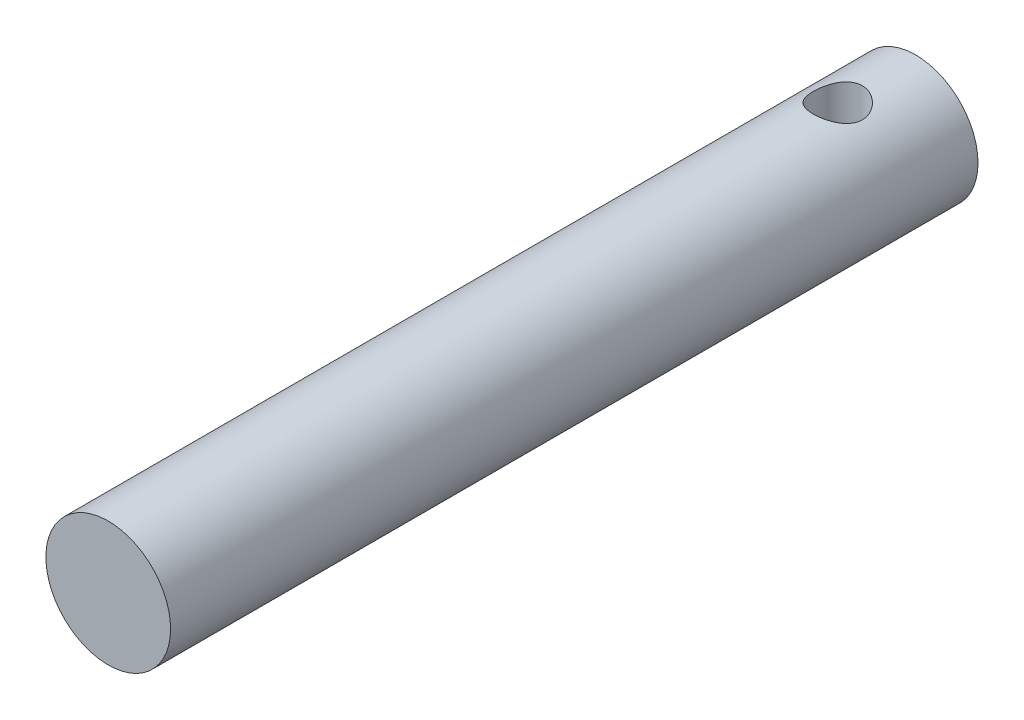
ISO-10303-21;
HEADER;
FILE_DESCRIPTION(('STEP AP214'),'2;1');
FILE_NAME('part.step','',(''),(''),'','','');
FILE_SCHEMA(('AUTOMOTIVE_DESIGN { 1 0 10303 214 1 1 1 1 }'));
ENDSEC;
DATA;
#1=APPLICATION_CONTEXT('core data for automotive mechanical design processes');
#2=APPLICATION_PROTOCOL_DEFINITION('international standard','automotive_design',2000,#1);
#3=PRODUCT_CONTEXT('',#1,'mechanical');
#4=PRODUCT('Part','Part','',(#3));
#5=PRODUCT_RELATED_PRODUCT_CATEGORY('part','',(#4));
#6=PRODUCT_DEFINITION_FORMATION('','',#4);
#7=PRODUCT_DEFINITION_CONTEXT('part definition',#1,'design');
#8=PRODUCT_DEFINITION('design','',#6,#7);
#9=PRODUCT_DEFINITION_SHAPE('','',#8);
#10=(LENGTH_UNIT() NAMED_UNIT(*) SI_UNIT(.MILLI.,.METRE.));
#11=(NAMED_UNIT(*) PLANE_ANGLE_UNIT() SI_UNIT($,.RADIAN.));
#12=(NAMED_UNIT(*) SI_UNIT($,.STERADIAN.) SOLID_ANGLE_UNIT());
#13=UNCERTAINTY_MEASURE_WITH_UNIT(LENGTH_MEASURE(1.E-05),#10,'distance_accuracy_value','');
#14=(GEOMETRIC_REPRESENTATION_CONTEXT(3) GLOBAL_UNCERTAINTY_ASSIGNED_CONTEXT((#13)) GLOBAL_UNIT_ASSIGNED_CONTEXT((#10,
#11,#12)) REPRESENTATION_CONTEXT('',''));
#15=CARTESIAN_POINT('',(0.,0.,0.));
#16=DIRECTION('',(0.,0.,1.));
#17=DIRECTION('',(1.,0.,0.));
#18=AXIS2_PLACEMENT_3D('',#15,#16,#17);
#19=CARTESIAN_POINT('',(0.,0.,51.8));
#20=DIRECTION('',(0.,0.,-1.));
#21=DIRECTION('',(-1.,0.,0.));
#22=AXIS2_PLACEMENT_3D('',#19,#20,#21);
#23=CYLINDRICAL_SURFACE('',#22,4.);
#24=CARTESIAN_POINT('',(0.,-4.,6.575));
#25=CARTESIAN_POINT('',(-0.084777957351503,-3.99999371475786,6.5749913504673));
#26=CARTESIAN_POINT('',(-0.169682998159235,-3.99727371103869,6.56811600545231));
#27=CARTESIAN_POINT('',(-0.337099997729513,-3.98665835198979,6.54085024426793));
#28=CARTESIAN_POINT('',(-0.419605283421263,-3.97874978320654,6.52042532059411));
#29=CARTESIAN_POINT('',(-0.579541037228178,-3.95861166157483,6.46691575860037));
#30=CARTESIAN_POINT('',(-0.656986633552023,-3.94639576106684,6.43387109211161));
#31=CARTESIAN_POINT('',(-0.805171409141907,-3.91885018887286,6.3562174109327));
#32=CARTESIAN_POINT('',(-0.875912626211128,-3.90352146781271,6.31161192566052));
#33=CARTESIAN_POINT('',(-1.01202123881492,-3.87051957423171,6.2099387442384));
#34=CARTESIAN_POINT('',(-1.07704023299287,-3.85277517023923,6.15242792977124));
#35=CARTESIAN_POINT('',(-1.19680261742581,-3.81727298467867,6.02751213720201));
#36=CARTESIAN_POINT('',(-1.25154127100046,-3.79951520071053,5.96010262362511));
#37=CARTESIAN_POINT('',(-1.35149622712963,-3.76515274878395,5.81379400336829));
#38=CARTESIAN_POINT('',(-1.39620428835686,-3.74863004117912,5.73452645967399));
#39=CARTESIAN_POINT('',(-1.4714979631349,-3.71972210574232,5.56884754848047));
#40=CARTESIAN_POINT('',(-1.50209002876568,-3.70733498834933,5.48243946608596));
#41=CARTESIAN_POINT('',(-1.54688452039642,-3.68886368487684,5.30893328431349));
#42=CARTESIAN_POINT('',(-1.56175270070066,-3.68252469132068,5.22203516293125));
#43=CARTESIAN_POINT('',(-1.57675761493808,-3.67612688298866,5.04676403011906));
#44=CARTESIAN_POINT('',(-1.57690129576139,-3.67606510667669,4.95839173387513));
#45=CARTESIAN_POINT('',(-1.56295884668395,-3.68201073018886,4.78899793457456));
#46=CARTESIAN_POINT('',(-1.54982637788304,-3.68761138493157,4.70788091917912));
#47=CARTESIAN_POINT('',(-1.51129105930388,-3.70356985031701,4.54911165377539));
#48=CARTESIAN_POINT('',(-1.48588614051495,-3.71392846308876,4.47145999040257));
#49=CARTESIAN_POINT('',(-1.42304900510824,-3.73846017950747,4.31998753086632));
#50=CARTESIAN_POINT('',(-1.38538580029301,-3.75270561609433,4.24627479364249));
#51=CARTESIAN_POINT('',(-1.29926305698382,-3.78338491615335,4.10595079309995));
#52=CARTESIAN_POINT('',(-1.25079954413666,-3.79981958433241,4.03934215736088));
#53=CARTESIAN_POINT('',(-1.14019477904158,-3.83452142143146,3.90988154903872));
#54=CARTESIAN_POINT('',(-1.07730223583062,-3.85283377175234,3.84768186986216));
#55=CARTESIAN_POINT('',(-0.941779585031376,-3.88818092911688,3.73450742601084));
#56=CARTESIAN_POINT('',(-0.86914766023362,-3.90521549682,3.68353476081501));
#57=CARTESIAN_POINT('',(-0.714405632415331,-3.9364909974616,3.59344090793809));
#58=CARTESIAN_POINT('',(-0.632144307591836,-3.95067404747593,3.55455790470879));
#59=CARTESIAN_POINT('',(-0.461548638212615,-3.97421306585263,3.49140490019745));
#60=CARTESIAN_POINT('',(-0.373217303441472,-3.98357140722824,3.46712771412097));
#61=CARTESIAN_POINT('',(-0.198462358887899,-3.99597801788296,3.43517798744733));
#62=CARTESIAN_POINT('',(-0.112222626172096,-3.99935914098446,3.42662839759178));
#63=CARTESIAN_POINT('',(0.0605167823400057,-4.00047376408071,3.4237959948164));
#64=CARTESIAN_POINT('',(0.147016387944331,-3.99820867234557,3.42950962438713));
#65=CARTESIAN_POINT('',(0.313892303734837,-3.98850378373963,3.45439079842812));
#66=CARTESIAN_POINT('',(0.39437165124116,-3.98129199937254,3.47296585256132));
#67=CARTESIAN_POINT('',(0.551001661904486,-3.96265344988104,3.52224308988292));
#68=CARTESIAN_POINT('',(0.627151765123054,-3.95122614095146,3.55294683771621));
#69=CARTESIAN_POINT('',(0.775558341492031,-3.92483948181058,3.62660805564172));
#70=CARTESIAN_POINT('',(0.847626598447584,-3.90978349311696,3.66990902342593));
#71=CARTESIAN_POINT('',(0.983724744227115,-3.87778045628887,3.76715276739036));
#72=CARTESIAN_POINT('',(1.0477514529063,-3.86083266498705,3.82109973213253));
#73=CARTESIAN_POINT('',(1.17024451292195,-3.82555203890851,3.94215661270057));
#74=CARTESIAN_POINT('',(1.22809278030705,-3.80719997766011,4.00988797592606));
#75=CARTESIAN_POINT('',(1.33174647713903,-3.77219465383469,4.15443150282617));
#76=CARTESIAN_POINT('',(1.37755017513242,-3.75554163571206,4.23124496979012));
#77=CARTESIAN_POINT('',(1.45603682361559,-3.72582087293399,4.39278803576521));
#78=CARTESIAN_POINT('',(1.48860964322187,-3.71278349733253,4.47757712329371));
#79=CARTESIAN_POINT('',(1.53877245108985,-3.69227947569873,4.65210243409606));
#80=CARTESIAN_POINT('',(1.55637302525858,-3.68480889421037,4.74183511419922));
#81=CARTESIAN_POINT('',(1.57509591497035,-3.67684195065122,4.91692803991798));
#82=CARTESIAN_POINT('',(1.5772860734323,-3.6758937420289,5.00215431051799));
#83=CARTESIAN_POINT('',(1.56791275226873,-3.67990154786674,5.17169719904443));
#84=CARTESIAN_POINT('',(1.55635089322198,-3.68485686663772,5.25601392297312));
#85=CARTESIAN_POINT('',(1.52066391144084,-3.6997203856089,5.41814425204745));
#86=CARTESIAN_POINT('',(1.49702111331917,-3.70943788900835,5.49608307424026));
#87=CARTESIAN_POINT('',(1.43828779116844,-3.73260226373705,5.64692245392718));
#88=CARTESIAN_POINT('',(1.40319424484293,-3.74605011951035,5.71982167511244));
#89=CARTESIAN_POINT('',(1.32027940505378,-3.77609694201628,5.86296438731432));
#90=CARTESIAN_POINT('',(1.27185474580919,-3.79283032284862,5.93282972651265));
#91=CARTESIAN_POINT('',(1.16454412559117,-3.82714084093243,6.06378253986384));
#92=CARTESIAN_POINT('',(1.10565450981896,-3.84471827139098,6.12486693381897));
#93=CARTESIAN_POINT('',(0.974730917482345,-3.8800479008807,6.24040765302804));
#94=CARTESIAN_POINT('',(0.902107589375748,-3.89774310203432,6.29421634714681));
#95=CARTESIAN_POINT('',(0.748205773672022,-3.9301854745353,6.38887250744573));
#96=CARTESIAN_POINT('',(0.666926137124022,-3.94493225378965,6.42971825018406));
#97=CARTESIAN_POINT('',(0.505143265297428,-3.96874604080368,6.49411684047061));
#98=CARTESIAN_POINT('',(0.425161570693122,-3.9781893540543,6.51884470323385));
#99=CARTESIAN_POINT('',(0.262019529546968,-3.99224240110566,6.55528644356018));
#100=CARTESIAN_POINT('',(0.178868575204488,-3.99686541666115,6.56703608639648));
#101=CARTESIAN_POINT('',(0.0636199690864305,-3.99962244799311,6.57403921053329));
#102=CARTESIAN_POINT('',(0.03181893539601,-4.00000235898245,6.57500324635));
#103=CARTESIAN_POINT('',(0.,-4.,6.575));
#104=B_SPLINE_CURVE_WITH_KNOTS('',3,(#24,#25,#26,#27,#28,#29,#30,#31,#32,#33,#34,#35,#36,#37,
#38,#39,#40,#41,#42,#43,#44,#45,#46,#47,#48,#49,#50,#51,#52,#53,#54,#55,#56,#57,#58,#59,#60,#61,
#62,#63,#64,#65,#66,#67,#68,#69,#70,#71,#72,#73,#74,#75,#76,#77,#78,#79,#80,#81,#82,#83,#84,#85,
#86,#87,#88,#89,#90,#91,#92,#93,#94,#95,#96,#97,#98,#99,#100,#101,#102,#103),.UNSPECIFIED.,.T.,
.F.,(4,2,2,2,2,2,2,2,2,2,2,2,2,2,2,2,2,2,2,2,2,2,2,2,2,2,2,2,2,2,2,2,2,2,2,2,2,2,2,4),(0.,
0.254239588162719,0.509129161714249,0.763218004382729,1.01722936711086,1.28186231395848,
1.54661689324381,1.82271064959156,2.09867808485329,2.36242561173228,2.62604870426095,
2.87199219089392,3.11797715558421,3.36889531912676,3.61990596974727,3.88966690514255,
4.15947824373952,4.43431028043799,4.70900701285129,4.96785798249349,5.2266443963902,
5.47423976701851,5.72186708877203,5.97700701922233,6.23224753280258,6.50382283959259,
6.77543716506832,7.04926817126425,7.32290540795412,7.57737617303126,7.83181695348511,
8.07681203446012,8.32187183151417,8.58067351569428,8.83956576247479,9.11454362371647,
9.38955802833389,9.64119010629957,9.89212699500845,9.98754841448564),.UNSPECIFIED.);
#105=CARTESIAN_POINT('',(0.,-4.,6.575));
#106=VERTEX_POINT('',#105);
#107=EDGE_CURVE('E41',#106,#106,#104,.T.);
#108=ORIENTED_EDGE('',*,*,#107,.F.);
#109=EDGE_LOOP('',(#108));
#110=FACE_BOUND('',#109,.T.);
#111=CARTESIAN_POINT('',(0.,4.,3.425));
#112=CARTESIAN_POINT('',(0.0847779573515032,3.99999371475786,3.4250086495327));
#113=CARTESIAN_POINT('',(0.169682998159236,3.99727371103869,3.43188399454769));
#114=CARTESIAN_POINT('',(0.337099997729514,3.98665835198979,3.45914975573206));
#115=CARTESIAN_POINT('',(0.419605283421263,3.97874978320654,3.47957467940589));
#116=CARTESIAN_POINT('',(0.579541037228178,3.95861166157483,3.53308424139963));
#117=CARTESIAN_POINT('',(0.656986633552023,3.94639576106684,3.56612890788839));
#118=CARTESIAN_POINT('',(0.805171409141908,3.91885018887286,3.6437825890673));
#119=CARTESIAN_POINT('',(0.875912626211129,3.90352146781271,3.68838807433948));
#120=CARTESIAN_POINT('',(1.01202123881492,3.87051957423171,3.7900612557616));
#121=CARTESIAN_POINT('',(1.07704023299288,3.85277517023923,3.84757207022876));
#122=CARTESIAN_POINT('',(1.19680261742581,3.81727298467867,3.97248786279799));
#123=CARTESIAN_POINT('',(1.25154127100046,3.79951520071053,4.03989737637489));
#124=CARTESIAN_POINT('',(1.35149622712963,3.76515274878395,4.18620599663171));
#125=CARTESIAN_POINT('',(1.39620428835686,3.74863004117912,4.26547354032601));
#126=CARTESIAN_POINT('',(1.4714979631349,3.71972210574232,4.43115245151953));
#127=CARTESIAN_POINT('',(1.50209002876568,3.70733498834933,4.51756053391404));
#128=CARTESIAN_POINT('',(1.54688452039642,3.68886368487684,4.69106671568651));
#129=CARTESIAN_POINT('',(1.56175270070066,3.68252469132068,4.77796483706875));
#130=CARTESIAN_POINT('',(1.57675761493808,3.67612688298866,4.95323596988094));
#131=CARTESIAN_POINT('',(1.57690129576139,3.67606510667669,5.04160826612487));
#132=CARTESIAN_POINT('',(1.56295884668395,3.68201073018886,5.21100206542544));
#133=CARTESIAN_POINT('',(1.54982637788304,3.68761138493157,5.29211908082088));
#134=CARTESIAN_POINT('',(1.51129105930388,3.70356985031701,5.4508883462246));
#135=CARTESIAN_POINT('',(1.48588614051495,3.71392846308876,5.52854000959742));
#136=CARTESIAN_POINT('',(1.42304900510824,3.73846017950747,5.68001246913368));
#137=CARTESIAN_POINT('',(1.38538580029301,3.75270561609433,5.75372520635751));
#138=CARTESIAN_POINT('',(1.29926305698382,3.78338491615335,5.89404920690005));
#139=CARTESIAN_POINT('',(1.25079954413666,3.79981958433241,5.96065784263912));
#140=CARTESIAN_POINT('',(1.14019477904158,3.83452142143145,6.09011845096127));
#141=CARTESIAN_POINT('',(1.07730223583062,3.85283377175234,6.15231813013784));
#142=CARTESIAN_POINT('',(0.941779585031375,3.88818092911688,6.26549257398916));
#143=CARTESIAN_POINT('',(0.869147660233619,3.90521549682,6.316465239185));
#144=CARTESIAN_POINT('',(0.714405632415329,3.9364909974616,6.40655909206191));
#145=CARTESIAN_POINT('',(0.632144307591833,3.95067404747593,6.44544209529121));
#146=CARTESIAN_POINT('',(0.461548638212613,3.97421306585263,6.50859509980255));
#147=CARTESIAN_POINT('',(0.37321730344147,3.98357140722824,6.53287228587903));
#148=CARTESIAN_POINT('',(0.198462358887898,3.99597801788296,6.56482201255267));
#149=CARTESIAN_POINT('',(0.112222626172095,3.99935914098446,6.57337160240822));
#150=CARTESIAN_POINT('',(-0.0605167823400069,4.00047376408071,6.5762040051836));
#151=CARTESIAN_POINT('',(-0.147016387944332,3.99820867234557,6.57049037561287));
#152=CARTESIAN_POINT('',(-0.313892303734838,3.98850378373963,6.54560920157188));
#153=CARTESIAN_POINT('',(-0.394371651241161,3.98129199937254,6.52703414743868));
#154=CARTESIAN_POINT('',(-0.551001661904487,3.96265344988104,6.47775691011708));
#155=CARTESIAN_POINT('',(-0.627151765123054,3.95122614095146,6.44705316228379));
#156=CARTESIAN_POINT('',(-0.77555834149203,3.92483948181058,6.37339194435828));
#157=CARTESIAN_POINT('',(-0.847626598447583,3.90978349311696,6.33009097657408));
#158=CARTESIAN_POINT('',(-0.983724744227114,3.87778045628887,6.23284723260964));
#159=CARTESIAN_POINT('',(-1.0477514529063,3.86083266498705,6.17890026786747));
#160=CARTESIAN_POINT('',(-1.17024451292195,3.82555203890851,6.05784338729943));
#161=CARTESIAN_POINT('',(-1.22809278030705,3.80719997766011,5.99011202407394));
#162=CARTESIAN_POINT('',(-1.33174647713902,3.77219465383469,5.84556849717383));
#163=CARTESIAN_POINT('',(-1.37755017513242,3.75554163571206,5.76875503020988));
#164=CARTESIAN_POINT('',(-1.45603682361559,3.72582087293399,5.60721196423479));
#165=CARTESIAN_POINT('',(-1.48860964322187,3.71278349733253,5.52242287670629));
#166=CARTESIAN_POINT('',(-1.53877245108985,3.69227947569873,5.34789756590394));
#167=CARTESIAN_POINT('',(-1.55637302525858,3.68480889421037,5.25816488580078));
#168=CARTESIAN_POINT('',(-1.57509591497035,3.67684195065122,5.08307196008202));
#169=CARTESIAN_POINT('',(-1.5772860734323,3.6758937420289,4.997845689482));
#170=CARTESIAN_POINT('',(-1.56791275226873,3.67990154786674,4.82830280095556));
#171=CARTESIAN_POINT('',(-1.55635089322198,3.68485686663772,4.74398607702687));
#172=CARTESIAN_POINT('',(-1.52066391144084,3.6997203856089,4.58185574795255));
#173=CARTESIAN_POINT('',(-1.49702111331917,3.70943788900835,4.50391692575974));
#174=CARTESIAN_POINT('',(-1.43828779116844,3.73260226373705,4.35307754607282));
#175=CARTESIAN_POINT('',(-1.40319424484293,3.74605011951036,4.28017832488756));
#176=CARTESIAN_POINT('',(-1.32027940505378,3.77609694201628,4.13703561268568));
#177=CARTESIAN_POINT('',(-1.27185474580919,3.79283032284862,4.06717027348735));
#178=CARTESIAN_POINT('',(-1.16454412559117,3.82714084093243,3.93621746013616));
#179=CARTESIAN_POINT('',(-1.10565450981896,3.84471827139098,3.87513306618103));
#180=CARTESIAN_POINT('',(-0.974730917482344,3.8800479008807,3.75959234697196));
#181=CARTESIAN_POINT('',(-0.902107589375747,3.89774310203432,3.70578365285319));
#182=CARTESIAN_POINT('',(-0.748205773672021,3.9301854745353,3.61112749255427));
#183=CARTESIAN_POINT('',(-0.666926137124022,3.94493225378965,3.57028174981594));
#184=CARTESIAN_POINT('',(-0.505143265297428,3.96874604080368,3.50588315952939));
#185=CARTESIAN_POINT('',(-0.425161570693121,3.9781893540543,3.48115529676615));
#186=CARTESIAN_POINT('',(-0.262019529546966,3.99224240110566,3.44471355643982));
#187=CARTESIAN_POINT('',(-0.178868575204487,3.99686541666115,3.43296391360352));
#188=CARTESIAN_POINT('',(-0.0636199690864298,3.99962244799311,3.42596078946671));
#189=CARTESIAN_POINT('',(-0.0318189353960096,4.00000235898245,3.42499675365));
#190=CARTESIAN_POINT('',(0.,4.,3.425));
#191=B_SPLINE_CURVE_WITH_KNOTS('',3,(#111,#112,#113,#114,#115,#116,#117,#118,#119,#120,#121,
#122,#123,#124,#125,#126,#127,#128,#129,#130,#131,#132,#133,#134,#135,#136,#137,#138,#139,#140,
#141,#142,#143,#144,#145,#146,#147,#148,#149,#150,#151,#152,#153,#154,#155,#156,#157,#158,#159,
#160,#161,#162,#163,#164,#165,#166,#167,#168,#169,#170,#171,#172,#173,#174,#175,#176,#177,#178,
#179,#180,#181,#182,#183,#184,#185,#186,#187,#188,#189,#190),.UNSPECIFIED.,.T.,.F.,(4,2,2,2,2,2,
2,2,2,2,2,2,2,2,2,2,2,2,2,2,2,2,2,2,2,2,2,2,2,2,2,2,2,2,2,2,2,2,2,4),(0.,0.25423958816272,
0.50912916171425,0.76321800438273,1.01722936711087,1.28186231395849,1.54661689324381,
1.82271064959156,2.09867808485329,2.36242561173228,2.62604870426095,2.87199219089392,
3.11797715558421,3.36889531912676,3.61990596974727,3.88966690514255,4.15947824373952,
4.43431028043799,4.70900701285129,4.96785798249349,5.2266443963902,5.47423976701851,
5.72186708877203,5.97700701922232,6.23224753280258,6.50382283959259,6.77543716506832,
7.04926817126424,7.32290540795412,7.57737617303126,7.83181695348511,8.07681203446012,
8.32187183151417,8.58067351569428,8.83956576247479,9.11454362371647,9.38955802833389,
9.64119010629957,9.89212699500844,9.98754841448564),.UNSPECIFIED.);
#192=CARTESIAN_POINT('',(0.,4.,3.425));
#193=VERTEX_POINT('',#192);
#194=EDGE_CURVE('E49',#193,#193,#191,.T.);
#195=ORIENTED_EDGE('',*,*,#194,.T.);
#196=EDGE_LOOP('',(#195));
#197=FACE_BOUND('',#196,.T.);
#198=CARTESIAN_POINT('',(0.,0.,51.8));
#199=DIRECTION('',(0.,0.,1.));
#200=DIRECTION('',(1.,0.,0.));
#201=AXIS2_PLACEMENT_3D('',#198,#199,#200);
#202=CIRCLE('',#201,4.);
#203=CARTESIAN_POINT('',(4.,0.,51.8));
#204=VERTEX_POINT('',#203);
#205=EDGE_CURVE('E10',#204,#204,#202,.T.);
#206=ORIENTED_EDGE('',*,*,#205,.F.);
#207=EDGE_LOOP('',(#206));
#208=FACE_BOUND('',#207,.T.);
#209=CARTESIAN_POINT('',(0.,0.,0.));
#210=DIRECTION('',(0.,0.,1.));
#211=DIRECTION('',(1.,0.,0.));
#212=AXIS2_PLACEMENT_3D('',#209,#210,#211);
#213=CIRCLE('',#212,4.);
#214=CARTESIAN_POINT('',(4.,0.,0.));
#215=VERTEX_POINT('',#214);
#216=EDGE_CURVE('E34',#215,#215,#213,.T.);
#217=ORIENTED_EDGE('',*,*,#216,.T.);
#218=EDGE_LOOP('',(#217));
#219=FACE_BOUND('',#218,.T.);
#220=ADVANCED_FACE('F31',(#110,#197,#208,#219),#23,.T.);
#221=CARTESIAN_POINT('',(0.,0.,51.8));
#222=DIRECTION('',(0.,0.,1.));
#223=DIRECTION('',(1.,0.,0.));
#224=AXIS2_PLACEMENT_3D('',#221,#222,#223);
#225=PLANE('',#224);
#226=ORIENTED_EDGE('',*,*,#205,.T.);
#227=EDGE_LOOP('',(#226));
#228=FACE_BOUND('',#227,.T.);
#229=ADVANCED_FACE('F58',(#228),#225,.T.);
#230=CARTESIAN_POINT('',(0.,0.,0.));
#231=DIRECTION('',(0.,0.,1.));
#232=DIRECTION('',(1.,0.,0.));
#233=AXIS2_PLACEMENT_3D('',#230,#231,#232);
#234=PLANE('',#233);
#235=ORIENTED_EDGE('',*,*,#216,.F.);
#236=EDGE_LOOP('',(#235));
#237=FACE_BOUND('',#236,.T.);
#238=ADVANCED_FACE('F60',(#237),#234,.F.);
#239=CARTESIAN_POINT('',(0.,-4.001,5.));
#240=DIRECTION('',(0.,1.,0.));
#241=DIRECTION('',(0.,0.,1.));
#242=AXIS2_PLACEMENT_3D('',#239,#240,#241);
#243=CYLINDRICAL_SURFACE('',#242,1.575);
#244=ORIENTED_EDGE('',*,*,#107,.T.);
#245=EDGE_LOOP('',(#244));
#246=FACE_BOUND('',#245,.T.);
#247=ORIENTED_EDGE('',*,*,#194,.F.);
#248=EDGE_LOOP('',(#247));
#249=FACE_BOUND('',#248,.T.);
#250=ADVANCED_FACE('F54',(#246,#249),#243,.F.);
#251=CLOSED_SHELL('',(#220,#229,#238,#250));
#252=MANIFOLD_SOLID_BREP('B2',#251);
#253=ADVANCED_BREP_SHAPE_REPRESENTATION('',(#18,#252),#14);
#254=SHAPE_DEFINITION_REPRESENTATION(#9,#253);
ENDSEC;
END-ISO-10303-21;
